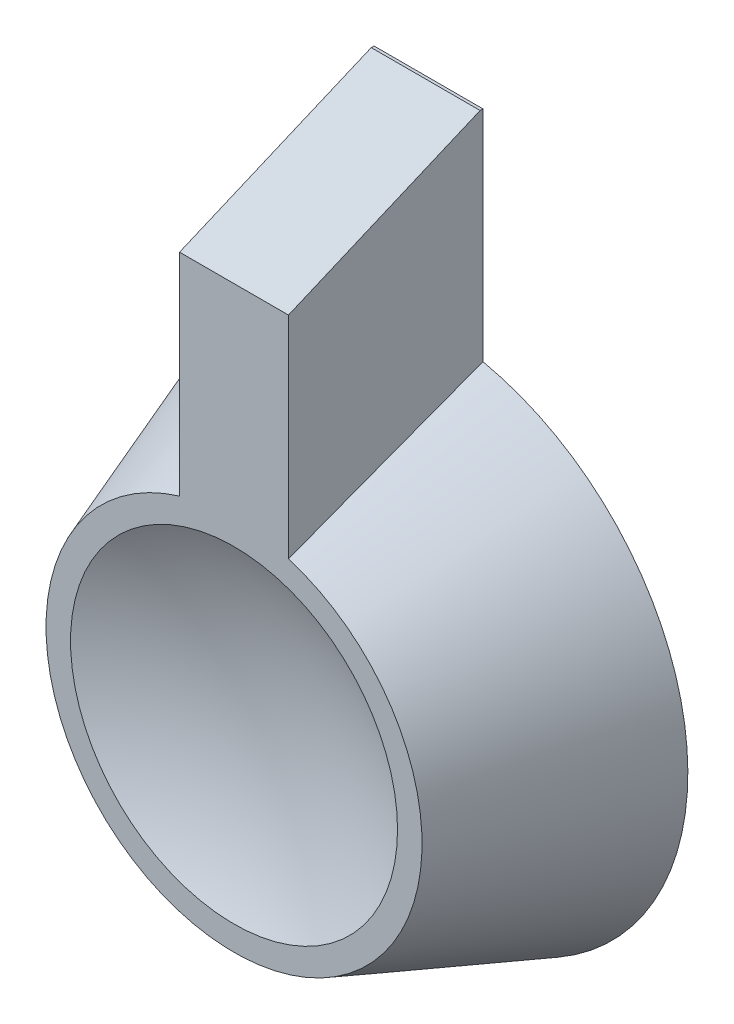
ISO-10303-21;
HEADER;
FILE_DESCRIPTION(('STEP AP214'),'2;1');
FILE_NAME('part.step','',(''),(''),'','','');
FILE_SCHEMA(('AUTOMOTIVE_DESIGN { 1 0 10303 214 1 1 1 1 }'));
ENDSEC;
DATA;
#1=APPLICATION_CONTEXT('core data for automotive mechanical design processes');
#2=APPLICATION_PROTOCOL_DEFINITION('international standard','automotive_design',2000,#1);
#3=PRODUCT_CONTEXT('',#1,'mechanical');
#4=PRODUCT('Part','Part','',(#3));
#5=PRODUCT_RELATED_PRODUCT_CATEGORY('part','',(#4));
#6=PRODUCT_DEFINITION_FORMATION('','',#4);
#7=PRODUCT_DEFINITION_CONTEXT('part definition',#1,'design');
#8=PRODUCT_DEFINITION('design','',#6,#7);
#9=PRODUCT_DEFINITION_SHAPE('','',#8);
#10=(LENGTH_UNIT() NAMED_UNIT(*) SI_UNIT(.MILLI.,.METRE.));
#11=(NAMED_UNIT(*) PLANE_ANGLE_UNIT() SI_UNIT($,.RADIAN.));
#12=(NAMED_UNIT(*) SI_UNIT($,.STERADIAN.) SOLID_ANGLE_UNIT());
#13=UNCERTAINTY_MEASURE_WITH_UNIT(LENGTH_MEASURE(1.E-05),#10,'distance_accuracy_value','');
#14=(GEOMETRIC_REPRESENTATION_CONTEXT(3) GLOBAL_UNCERTAINTY_ASSIGNED_CONTEXT((#13)) GLOBAL_UNIT_ASSIGNED_CONTEXT((#10,
#11,#12)) REPRESENTATION_CONTEXT('',''));
#15=CARTESIAN_POINT('',(0.,0.,0.));
#16=DIRECTION('',(0.,0.,1.));
#17=DIRECTION('',(1.,0.,0.));
#18=AXIS2_PLACEMENT_3D('',#15,#16,#17);
#19=CARTESIAN_POINT('',(0.,0.75,-0.1));
#20=DIRECTION('',(0.,-1.,0.));
#21=DIRECTION('',(1.,0.,0.));
#22=AXIS2_PLACEMENT_3D('',#19,#20,#21);
#23=PLANE('',#22);
#24=CARTESIAN_POINT('',(2.95634909985506,0.749999999998106,0.500000000093635));
#25=CARTESIAN_POINT('',(3.02786630832363,0.749999999999053,0.416793370473385));
#26=CARTESIAN_POINT('',(3.09930954240302,0.749999999999684,0.333523386887634));
#27=CARTESIAN_POINT('',(3.24204805459095,0.750000000000315,0.166856720183341));
#28=CARTESIAN_POINT('',(3.3133433327144,0.750000000000315,0.0834600370775675));
#29=CARTESIAN_POINT('',(3.38456463646358,0.749999999999999,1.90627537618438E-11));
#30=B_SPLINE_CURVE_WITH_KNOTS('',3,(#24,#25,#26,#27,#28,#29),.UNSPECIFIED.,.F.,.F.,(4,2,4),(0.,
0.329153813222395,0.658307593273155),.UNSPECIFIED.);
#31=CARTESIAN_POINT('',(2.95634909983757,0.749999999999994,0.500000000069837));
#32=VERTEX_POINT('',#31);
#33=CARTESIAN_POINT('',(3.38456463644346,0.749999999999999,4.2632564145606E-11));
#34=VERTEX_POINT('',#33);
#35=EDGE_CURVE('E148',#32,#34,#30,.T.);
#36=ORIENTED_EDGE('',*,*,#35,.T.);
#37=DIRECTION('',(1.,0.,0.));
#38=VECTOR('',#37,1.);
#39=CARTESIAN_POINT('',(0.,0.75,2.8421709430404E-11));
#40=LINE('',#39,#38);
#41=CARTESIAN_POINT('',(4.7283883353948,0.749999999999999,4.28222610676579E-11));
#42=VERTEX_POINT('',#41);
#43=EDGE_CURVE('E151',#34,#42,#40,.T.);
#44=ORIENTED_EDGE('',*,*,#43,.T.);
#45=CARTESIAN_POINT('',(4.72838833539125,0.749999999999999,2.88009761255712E-11));
#46=CARTESIAN_POINT('',(4.76424620913798,0.749999999999999,0.141662214308324));
#47=CARTESIAN_POINT('',(4.80009528334224,0.749999999999999,0.28332665478563));
#48=CARTESIAN_POINT('',(4.87177583265981,0.749999999999999,0.566659988112073));
#49=CARTESIAN_POINT('',(4.90760730777312,0.749999999999999,0.708328880961209));
#50=CARTESIAN_POINT('',(4.94342998334396,0.749999999999999,0.850000000008127));
#51=B_SPLINE_CURVE_WITH_KNOTS('',3,(#45,#46,#47,#48,#49,#50),.UNSPECIFIED.,.F.,.F.,(4,2,4),(0.,
0.438389927294705,0.876779854515964),.UNSPECIFIED.);
#52=CARTESIAN_POINT('',(4.94342998333263,0.75000000000001,0.850000000011067));
#53=VERTEX_POINT('',#52);
#54=EDGE_CURVE('E20',#42,#53,#51,.T.);
#55=ORIENTED_EDGE('',*,*,#54,.T.);
#56=DIRECTION('',(0.,0.,1.));
#57=VECTOR('',#56,1.);
#58=CARTESIAN_POINT('',(4.94342998332129,0.750000000000022,-0.1));
#59=LINE('',#58,#57);
#60=CARTESIAN_POINT('',(4.94342998332129,0.75000000000001,4.5));
#61=VERTEX_POINT('',#60);
#62=EDGE_CURVE('E354',#61,#53,#59,.F.);
#63=ORIENTED_EDGE('',*,*,#62,.F.);
#64=DIRECTION('',(1.,0.,0.));
#65=VECTOR('',#64,1.);
#66=CARTESIAN_POINT('',(0.,0.749999999999999,4.5));
#67=LINE('',#66,#65);
#68=CARTESIAN_POINT('',(2.9563490998189,0.749999999999994,4.5));
#69=VERTEX_POINT('',#68);
#70=EDGE_CURVE('E280',#61,#69,#67,.F.);
#71=ORIENTED_EDGE('',*,*,#70,.T.);
#72=DIRECTION('',(0.,0.,1.));
#73=VECTOR('',#72,1.);
#74=CARTESIAN_POINT('',(2.9563490998189,0.749999999999988,-0.1));
#75=LINE('',#74,#73);
#76=EDGE_CURVE('E288',#69,#32,#75,.F.);
#77=ORIENTED_EDGE('',*,*,#76,.T.);
#78=EDGE_LOOP('',(#36,#44,#55,#63,#71,#77));
#79=FACE_BOUND('',#78,.T.);
#80=ADVANCED_FACE('F16',(#79),#23,.T.);
#81=CARTESIAN_POINT('',(-3.5,-6.,-0.1));
#82=DIRECTION('',(1.,0.,0.));
#83=DIRECTION('',(0.,0.,-1.));
#84=AXIS2_PLACEMENT_3D('',#81,#82,#83);
#85=PLANE('',#84);
#86=DIRECTION('',(0.,0.,1.));
#87=VECTOR('',#86,1.);
#88=CARTESIAN_POINT('',(-3.49999999999175,3.57071421427951,-0.1));
#89=LINE('',#88,#87);
#90=CARTESIAN_POINT('',(-3.49999999999588,3.57071421428372,0.850000000010505));
#91=VERTEX_POINT('',#90);
#92=CARTESIAN_POINT('',(-3.49999999999591,3.57071421427543,4.5));
#93=VERTEX_POINT('',#92);
#94=EDGE_CURVE('E287',#91,#93,#89,.T.);
#95=ORIENTED_EDGE('',*,*,#94,.F.);
#96=CARTESIAN_POINT('',(-3.5,3.57071421428793,0.850000000007003));
#97=CARTESIAN_POINT('',(-3.5,3.41531513223394,0.40609143112791));
#98=CARTESIAN_POINT('',(-3.5,3.26652051121143,2.8421709430404E-11));
#99=B_SPLINE_CURVE_WITH_KNOTS('',2,(#96,#97,#98),.UNSPECIFIED.,.F.,.F.,(3,3),(0.,1.),.UNSPECIFIED.);
#100=CARTESIAN_POINT('',(-3.5,3.26652051122415,4.2632564145606E-11));
#101=VERTEX_POINT('',#100);
#102=EDGE_CURVE('E405',#91,#101,#99,.T.);
#103=ORIENTED_EDGE('',*,*,#102,.T.);
#104=DIRECTION('',(0.,1.,0.));
#105=VECTOR('',#104,1.);
#106=CARTESIAN_POINT('',(-3.5,-6.,2.8421709430404E-11));
#107=LINE('',#106,#105);
#108=CARTESIAN_POINT('',(-3.5,4.53052149317802,-1.4210854715202E-11));
#109=VERTEX_POINT('',#108);
#110=EDGE_CURVE('E155',#101,#109,#107,.T.);
#111=ORIENTED_EDGE('',*,*,#110,.T.);
#112=CARTESIAN_POINT('',(-3.5,4.53052149317867,-2.8421709430404E-11));
#113=CARTESIAN_POINT('',(-3.5,4.38369587032704,0.464766211341005));
#114=CARTESIAN_POINT('',(-3.5,4.24264068711901,0.900000000000727));
#115=B_SPLINE_CURVE_WITH_KNOTS('',2,(#112,#113,#114),.UNSPECIFIED.,.F.,.F.,(3,3),(0.,1.),.UNSPECIFIED.);
#116=CARTESIAN_POINT('',(-3.50000000000009,4.24264068711908,0.900000000001091));
#117=VERTEX_POINT('',#116);
#118=EDGE_CURVE('E162',#109,#117,#115,.T.);
#119=ORIENTED_EDGE('',*,*,#118,.T.);
#120=DIRECTION('',(0.,0.,1.));
#121=VECTOR('',#120,1.);
#122=CARTESIAN_POINT('',(-3.50000000000017,4.24264068711914,-0.1));
#123=LINE('',#122,#121);
#124=CARTESIAN_POINT('',(-3.50000000000012,4.24264068711918,4.5));
#125=VERTEX_POINT('',#124);
#126=EDGE_CURVE('E351',#117,#125,#123,.T.);
#127=ORIENTED_EDGE('',*,*,#126,.T.);
#128=DIRECTION('',(0.,1.,0.));
#129=VECTOR('',#128,1.);
#130=CARTESIAN_POINT('',(-3.50000000000007,0.,4.5));
#131=LINE('',#130,#129);
#132=EDGE_CURVE('E278',#125,#93,#131,.F.);
#133=ORIENTED_EDGE('',*,*,#132,.T.);
#134=EDGE_LOOP('',(#95,#103,#111,#119,#127,#133));
#135=FACE_BOUND('',#134,.T.);
#136=ADVANCED_FACE('F245',(#135),#85,.T.);
#137=CARTESIAN_POINT('',(-3.5,-6.,-0.1));
#138=DIRECTION('',(1.,0.,0.));
#139=DIRECTION('',(0.,0.,-1.));
#140=AXIS2_PLACEMENT_3D('',#137,#138,#139);
#141=PLANE('',#140);
#142=DIRECTION('',(0.,0.,1.));
#143=VECTOR('',#142,1.);
#144=CARTESIAN_POINT('',(-3.50000000000007,-4.24264068711923,-0.1));
#145=LINE('',#144,#143);
#146=CARTESIAN_POINT('',(-3.49999999999996,-4.24264068711931,4.5));
#147=VERTEX_POINT('',#146);
#148=CARTESIAN_POINT('',(-3.50000000000004,-4.24264068712305,0.900000000001455));
#149=VERTEX_POINT('',#148);
#150=EDGE_CURVE('E358',#147,#149,#145,.F.);
#151=ORIENTED_EDGE('',*,*,#150,.T.);
#152=CARTESIAN_POINT('',(-3.5,-4.24264068712688,0.900000000001455));
#153=CARTESIAN_POINT('',(-3.5,-4.38369587048344,0.464766210845934));
#154=CARTESIAN_POINT('',(-3.5,-4.53052149317867,-2.8421709430404E-11));
#155=B_SPLINE_CURVE_WITH_KNOTS('',2,(#152,#153,#154),.UNSPECIFIED.,.F.,.F.,(3,3),(0.,1.),.UNSPECIFIED.);
#156=CARTESIAN_POINT('',(-3.5,-4.53052149317802,-1.4210854715202E-11));
#157=VERTEX_POINT('',#156);
#158=EDGE_CURVE('E250',#149,#157,#155,.T.);
#159=ORIENTED_EDGE('',*,*,#158,.T.);
#160=DIRECTION('',(0.,1.,0.));
#161=VECTOR('',#160,1.);
#162=CARTESIAN_POINT('',(-3.5,-6.,-2.8421709430404E-11));
#163=LINE('',#162,#161);
#164=CARTESIAN_POINT('',(-3.5,-3.26652051122486,4.26326183557146E-11));
#165=VERTEX_POINT('',#164);
#166=EDGE_CURVE('E257',#157,#165,#163,.T.);
#167=ORIENTED_EDGE('',*,*,#166,.T.);
#168=CARTESIAN_POINT('',(-3.5,-3.26652051121286,2.84218178506213E-11));
#169=CARTESIAN_POINT('',(-3.5,-3.41531513249915,0.406091431845201));
#170=CARTESIAN_POINT('',(-3.5,-3.57071421021738,0.849999988361538));
#171=B_SPLINE_CURVE_WITH_KNOTS('',2,(#168,#169,#170),.UNSPECIFIED.,.F.,.F.,(3,3),(0.,1.),.UNSPECIFIED.);
#172=CARTESIAN_POINT('',(-3.49999999999993,-3.57071421224447,0.849999994187772));
#173=VERTEX_POINT('',#172);
#174=EDGE_CURVE('E254',#165,#173,#171,.T.);
#175=ORIENTED_EDGE('',*,*,#174,.T.);
#176=DIRECTION('',(0.,0.,1.));
#177=VECTOR('',#176,1.);
#178=CARTESIAN_POINT('',(-3.49999999999986,-3.57071421427157,-0.1));
#179=LINE('',#178,#177);
#180=CARTESIAN_POINT('',(-3.49999999999986,-3.57071421427157,4.5));
#181=VERTEX_POINT('',#180);
#182=EDGE_CURVE('E268',#181,#173,#179,.F.);
#183=ORIENTED_EDGE('',*,*,#182,.F.);
#184=DIRECTION('',(0.,1.,0.));
#185=VECTOR('',#184,1.);
#186=CARTESIAN_POINT('',(-3.49999999999986,0.,4.5));
#187=LINE('',#186,#185);
#188=EDGE_CURVE('E224',#181,#147,#187,.F.);
#189=ORIENTED_EDGE('',*,*,#188,.T.);
#190=EDGE_LOOP('',(#151,#159,#167,#175,#183,#189));
#191=FACE_BOUND('',#190,.T.);
#192=ADVANCED_FACE('F238',(#191),#141,.T.);
#193=CARTESIAN_POINT('',(0.,-0.75,-0.1));
#194=DIRECTION('',(0.,-1.,0.));
#195=DIRECTION('',(1.,0.,0.));
#196=AXIS2_PLACEMENT_3D('',#193,#194,#195);
#197=PLANE('',#196);
#198=DIRECTION('',(1.,0.,0.));
#199=VECTOR('',#198,1.);
#200=CARTESIAN_POINT('',(0.,-0.75,6.13628071965966E-11));
#201=LINE('',#200,#199);
#202=CARTESIAN_POINT('',(3.38456463643778,-0.750000000000001,4.92926058480383E-11));
#203=VERTEX_POINT('',#202);
#204=CARTESIAN_POINT('',(4.72838833539892,-0.750000000000001,5.91031170944605E-11));
#205=VERTEX_POINT('',#204);
#206=EDGE_CURVE('E165',#203,#205,#201,.T.);
#207=ORIENTED_EDGE('',*,*,#206,.F.);
#208=CARTESIAN_POINT('',(2.95634909983741,-0.750000000000001,0.500000000116563));
#209=CARTESIAN_POINT('',(3.0278663083053,-0.750000000000001,0.416793370495934));
#210=CARTESIAN_POINT('',(3.09930954238421,-0.750000000000001,0.333523386909973));
#211=CARTESIAN_POINT('',(3.24204805457157,-0.750000000000001,0.166856720205597));
#212=CARTESIAN_POINT('',(3.31334333269493,-0.750000000000001,0.0834600370999507));
#213=CARTESIAN_POINT('',(3.38456463644422,-0.750000000000001,4.17418791497693E-11));
#214=B_SPLINE_CURVE_WITH_KNOTS('',3,(#208,#209,#210,#211,#212,#213),.UNSPECIFIED.,.F.,.F.,(4,2,
4),(0.,0.329153813221932,0.658307593272231),.UNSPECIFIED.);
#215=CARTESIAN_POINT('',(2.95634909982955,-0.749999999994515,0.500000000109213));
#216=VERTEX_POINT('',#215);
#217=EDGE_CURVE('E227',#216,#203,#214,.T.);
#218=ORIENTED_EDGE('',*,*,#217,.F.);
#219=DIRECTION('',(0.,0.,1.));
#220=VECTOR('',#219,1.);
#221=CARTESIAN_POINT('',(2.95634909982168,-0.749999999989029,-0.1));
#222=LINE('',#221,#220);
#223=CARTESIAN_POINT('',(2.95634909982029,-0.749999999994515,4.5));
#224=VERTEX_POINT('',#223);
#225=EDGE_CURVE('E284',#216,#224,#222,.T.);
#226=ORIENTED_EDGE('',*,*,#225,.T.);
#227=DIRECTION('',(1.,0.,0.));
#228=VECTOR('',#227,1.);
#229=CARTESIAN_POINT('',(0.,-0.75,4.5));
#230=LINE('',#229,#228);
#231=CARTESIAN_POINT('',(4.94342998332142,-0.749999999999167,4.5));
#232=VERTEX_POINT('',#231);
#233=EDGE_CURVE('E282',#224,#232,#230,.T.);
#234=ORIENTED_EDGE('',*,*,#233,.T.);
#235=DIRECTION('',(0.,0.,1.));
#236=VECTOR('',#235,1.);
#237=CARTESIAN_POINT('',(4.94342998332155,-0.749999999998334,-0.1));
#238=LINE('',#237,#236);
#239=CARTESIAN_POINT('',(4.94342998298697,-0.749999999999168,0.849999998643565));
#240=VERTEX_POINT('',#239);
#241=EDGE_CURVE('E271',#240,#232,#238,.T.);
#242=ORIENTED_EDGE('',*,*,#241,.F.);
#243=CARTESIAN_POINT('',(4.72838833539624,-0.750000000000001,4.85195228051522E-11));
#244=CARTESIAN_POINT('',(4.76424620902677,-0.750000000000001,0.141662213868951));
#245=CARTESIAN_POINT('',(4.80009528311488,-0.750000000000001,0.28332665388715));
#246=CARTESIAN_POINT('',(4.87177583220026,-0.750000000000001,0.566659986295353));
#247=CARTESIAN_POINT('',(4.90760730719753,-0.750000000000001,0.708328878685354));
#248=CARTESIAN_POINT('',(4.94342998265238,-0.750000000000001,0.849999997273124));
#249=B_SPLINE_CURVE_WITH_KNOTS('',3,(#243,#244,#245,#246,#247,#248),.UNSPECIFIED.,.F.,.F.,(4,2,
4),(0.,0.438389925873993,0.87677985167454),.UNSPECIFIED.);
#250=EDGE_CURVE('E217',#205,#240,#249,.T.);
#251=ORIENTED_EDGE('',*,*,#250,.F.);
#252=EDGE_LOOP('',(#207,#218,#226,#234,#242,#251));
#253=FACE_BOUND('',#252,.T.);
#254=ADVANCED_FACE('F232',(#253),#197,.F.);
#255=CARTESIAN_POINT('',(0.,0.,4.5));
#256=DIRECTION('',(0.,0.,1.));
#257=DIRECTION('',(1.,0.,0.));
#258=AXIS2_PLACEMENT_3D('',#255,#256,#257);
#259=PLANE('',#258);
#260=ORIENTED_EDGE('',*,*,#233,.F.);
#261=CARTESIAN_POINT('',(0.,0.,4.5));
#262=DIRECTION('',(0.,0.,1.));
#263=DIRECTION('',(1.,0.,0.));
#264=AXIS2_PLACEMENT_3D('',#261,#262,#263);
#265=CIRCLE('',#264,3.05);
#266=EDGE_CURVE('E225',#224,#69,#265,.F.);
#267=ORIENTED_EDGE('',*,*,#266,.T.);
#268=ORIENTED_EDGE('',*,*,#70,.F.);
#269=CARTESIAN_POINT('',(0.,0.,4.5));
#270=DIRECTION('',(0.,0.,1.));
#271=DIRECTION('',(1.,0.,0.));
#272=AXIS2_PLACEMENT_3D('',#269,#270,#271);
#273=CIRCLE('',#272,5.);
#274=EDGE_CURVE('E352',#93,#61,#273,.F.);
#275=ORIENTED_EDGE('',*,*,#274,.F.);
#276=ORIENTED_EDGE('',*,*,#132,.F.);
#277=CARTESIAN_POINT('',(0.,0.,4.5));
#278=DIRECTION('',(0.,0.,1.));
#279=DIRECTION('',(1.,0.,0.));
#280=AXIS2_PLACEMENT_3D('',#277,#278,#279);
#281=CIRCLE('',#280,5.5);
#282=EDGE_CURVE('E272',#125,#147,#281,.F.);
#283=ORIENTED_EDGE('',*,*,#282,.T.);
#284=ORIENTED_EDGE('',*,*,#188,.F.);
#285=CARTESIAN_POINT('',(0.,0.,4.5));
#286=DIRECTION('',(0.,0.,1.));
#287=DIRECTION('',(1.,0.,0.));
#288=AXIS2_PLACEMENT_3D('',#285,#286,#287);
#289=CIRCLE('',#288,5.);
#290=EDGE_CURVE('E275',#232,#181,#289,.F.);
#291=ORIENTED_EDGE('',*,*,#290,.F.);
#292=EDGE_LOOP('',(#260,#267,#268,#275,#276,#283,#284,#291));
#293=FACE_BOUND('',#292,.T.);
#294=ADVANCED_FACE('F237',(#293),#259,.F.);
#295=CARTESIAN_POINT('',(0.,0.,-0.1));
#296=DIRECTION('',(0.,0.,1.));
#297=DIRECTION('',(1.,0.,0.));
#298=AXIS2_PLACEMENT_3D('',#295,#296,#297);
#299=CYLINDRICAL_SURFACE('',#298,3.05);
#300=ORIENTED_EDGE('',*,*,#225,.F.);
#301=CARTESIAN_POINT('',(0.,0.,0.50000000004502));
#302=DIRECTION('',(0.,0.,-1.));
#303=DIRECTION('',(-1.,0.,0.));
#304=AXIS2_PLACEMENT_3D('',#301,#302,#303);
#305=CIRCLE('',#304,3.05000000008704);
#306=EDGE_CURVE('E291',#216,#32,#305,.T.);
#307=ORIENTED_EDGE('',*,*,#306,.T.);
#308=ORIENTED_EDGE('',*,*,#76,.F.);
#309=ORIENTED_EDGE('',*,*,#266,.F.);
#310=EDGE_LOOP('',(#300,#307,#308,#309));
#311=FACE_BOUND('',#310,.T.);
#312=ADVANCED_FACE('F372',(#311),#299,.F.);
#313=CARTESIAN_POINT('',(0.,0.,-0.1));
#314=DIRECTION('',(0.,0.,1.));
#315=DIRECTION('',(1.,0.,0.));
#316=AXIS2_PLACEMENT_3D('',#313,#314,#315);
#317=CYLINDRICAL_SURFACE('',#316,5.);
#318=ORIENTED_EDGE('',*,*,#274,.T.);
#319=ORIENTED_EDGE('',*,*,#62,.T.);
#320=CARTESIAN_POINT('',(0.,0.,0.850000000014006));
#321=DIRECTION('',(0.,0.,1.));
#322=DIRECTION('',(1.,0.,0.));
#323=AXIS2_PLACEMENT_3D('',#320,#321,#322);
#324=CIRCLE('',#323,5.00000000002387);
#325=EDGE_CURVE('E143',#91,#53,#324,.F.);
#326=ORIENTED_EDGE('',*,*,#325,.F.);
#327=ORIENTED_EDGE('',*,*,#94,.T.);
#328=EDGE_LOOP('',(#318,#319,#326,#327));
#329=FACE_BOUND('',#328,.T.);
#330=ADVANCED_FACE('F417',(#329),#317,.T.);
#331=CARTESIAN_POINT('',(0.,0.,-0.1));
#332=DIRECTION('',(0.,0.,1.));
#333=DIRECTION('',(1.,0.,0.));
#334=AXIS2_PLACEMENT_3D('',#331,#332,#333);
#335=CYLINDRICAL_SURFACE('',#334,5.5);
#336=CARTESIAN_POINT('',(0.,0.,0.900000000001455));
#337=DIRECTION('',(0.,0.,-1.));
#338=DIRECTION('',(-1.,0.,0.));
#339=AXIS2_PLACEMENT_3D('',#336,#337,#338);
#340=CIRCLE('',#339,5.50000000001205);
#341=EDGE_CURVE('E267',#117,#149,#340,.T.);
#342=ORIENTED_EDGE('',*,*,#341,.T.);
#343=ORIENTED_EDGE('',*,*,#150,.F.);
#344=ORIENTED_EDGE('',*,*,#282,.F.);
#345=ORIENTED_EDGE('',*,*,#126,.F.);
#346=EDGE_LOOP('',(#342,#343,#344,#345));
#347=FACE_BOUND('',#346,.T.);
#348=ADVANCED_FACE('F399',(#347),#335,.F.);
#349=CARTESIAN_POINT('',(0.,0.,-0.1));
#350=DIRECTION('',(0.,0.,1.));
#351=DIRECTION('',(1.,0.,0.));
#352=AXIS2_PLACEMENT_3D('',#349,#350,#351);
#353=CYLINDRICAL_SURFACE('',#352,5.);
#354=ORIENTED_EDGE('',*,*,#241,.T.);
#355=ORIENTED_EDGE('',*,*,#290,.T.);
#356=ORIENTED_EDGE('',*,*,#182,.T.);
#357=CARTESIAN_POINT('',(0.,0.,0.850000000014006));
#358=DIRECTION('',(0.,0.,1.));
#359=DIRECTION('',(1.,0.,0.));
#360=AXIS2_PLACEMENT_3D('',#357,#358,#359);
#361=CIRCLE('',#360,5.00000000002387);
#362=EDGE_CURVE('E258',#240,#173,#361,.F.);
#363=ORIENTED_EDGE('',*,*,#362,.F.);
#364=EDGE_LOOP('',(#354,#355,#356,#363));
#365=FACE_BOUND('',#364,.T.);
#366=ADVANCED_FACE('F393',(#365),#353,.T.);
#367=CARTESIAN_POINT('',(-2.2,18.22,0.11));
#368=DIRECTION('',(0.,0.,1.));
#369=DIRECTION('',(1.,0.,0.));
#370=AXIS2_PLACEMENT_3D('',#367,#368,#369);
#371=PLANE('',#370);
#372=DIRECTION('',(1.,0.,0.));
#373=VECTOR('',#372,1.);
#374=CARTESIAN_POINT('',(-2.2,18.22,0.11));
#375=LINE('',#374,#373);
#376=CARTESIAN_POINT('',(-2.1,18.22,0.11));
#377=VERTEX_POINT('',#376);
#378=CARTESIAN_POINT('',(2.1,18.22,0.11));
#379=VERTEX_POINT('',#378);
#380=EDGE_CURVE('E266',#377,#379,#375,.T.);
#381=ORIENTED_EDGE('',*,*,#380,.F.);
#382=DIRECTION('',(0.,1.,0.));
#383=VECTOR('',#382,1.);
#384=CARTESIAN_POINT('',(-2.1,6.5,0.11));
#385=LINE('',#384,#383);
#386=CARTESIAN_POINT('',(-2.1,18.2217638550304,0.109999999999963));
#387=VERTEX_POINT('',#386);
#388=EDGE_CURVE('E339',#387,#377,#385,.F.);
#389=ORIENTED_EDGE('',*,*,#388,.F.);
#390=DIRECTION('',(1.,0.,0.));
#391=VECTOR('',#390,1.);
#392=CARTESIAN_POINT('',(-2.5,18.2217638550302,0.109999999999853));
#393=LINE('',#392,#391);
#394=CARTESIAN_POINT('',(2.1,18.2217638550302,0.109999999999927));
#395=VERTEX_POINT('',#394);
#396=EDGE_CURVE('E300',#395,#387,#393,.F.);
#397=ORIENTED_EDGE('',*,*,#396,.F.);
#398=DIRECTION('',(0.,1.,0.));
#399=VECTOR('',#398,1.);
#400=CARTESIAN_POINT('',(2.1,6.5,0.11));
#401=LINE('',#400,#399);
#402=EDGE_CURVE('E294',#379,#395,#401,.T.);
#403=ORIENTED_EDGE('',*,*,#402,.F.);
#404=EDGE_LOOP('',(#381,#389,#397,#403));
#405=FACE_BOUND('',#404,.T.);
#406=ADVANCED_FACE('F344',(#405),#371,.F.);
#407=CARTESIAN_POINT('',(0.,0.,5.6843418860808E-11));
#408=DIRECTION('',(0.,0.,-1.));
#409=DIRECTION('',(-1.,0.,0.));
#410=AXIS2_PLACEMENT_3D('',#407,#408,#409);
#411=CONICAL_SURFACE('',#410,3.4666666667249,0.694738276185521);
#412=ORIENTED_EDGE('',*,*,#306,.F.);
#413=ORIENTED_EDGE('',*,*,#217,.T.);
#414=CARTESIAN_POINT('',(0.,0.,5.6843418860808E-11));
#415=DIRECTION('',(0.,0.,-1.));
#416=DIRECTION('',(-1.,0.,0.));
#417=AXIS2_PLACEMENT_3D('',#414,#415,#416);
#418=CIRCLE('',#417,3.4666666667249);
#419=EDGE_CURVE('E157',#203,#34,#418,.T.);
#420=ORIENTED_EDGE('',*,*,#419,.T.);
#421=ORIENTED_EDGE('',*,*,#35,.F.);
#422=EDGE_LOOP('',(#412,#413,#420,#421));
#423=FACE_BOUND('',#422,.T.);
#424=ADVANCED_FACE('F376',(#423),#411,.F.);
#425=CARTESIAN_POINT('',(0.,0.,0.850000000014006));
#426=DIRECTION('',(0.,0.,1.));
#427=DIRECTION('',(0.,-1.,0.));
#428=AXIS2_PLACEMENT_3D('',#425,#426,#427);
#429=CONICAL_SURFACE('',#428,5.00000000002387,0.244978663126864);
#430=ORIENTED_EDGE('',*,*,#325,.T.);
#431=ORIENTED_EDGE('',*,*,#54,.F.);
#432=CARTESIAN_POINT('',(0.,0.,5.6843418860808E-11));
#433=DIRECTION('',(0.,0.,1.));
#434=DIRECTION('',(0.,-1.,0.));
#435=AXIS2_PLACEMENT_3D('',#432,#433,#434);
#436=CIRCLE('',#435,4.78750000003458);
#437=EDGE_CURVE('E140',#42,#101,#436,.T.);
#438=ORIENTED_EDGE('',*,*,#437,.T.);
#439=ORIENTED_EDGE('',*,*,#102,.F.);
#440=EDGE_LOOP('',(#430,#431,#438,#439));
#441=FACE_BOUND('',#440,.T.);
#442=ADVANCED_FACE('F139',(#441),#429,.T.);
#443=CARTESIAN_POINT('',(0.,0.,0.));
#444=DIRECTION('',(0.,0.,-1.));
#445=DIRECTION('',(-1.,0.,0.));
#446=AXIS2_PLACEMENT_3D('',#443,#444,#445);
#447=CONICAL_SURFACE('',#446,5.72500000001241,0.244978663126864);
#448=ORIENTED_EDGE('',*,*,#118,.F.);
#449=CARTESIAN_POINT('',(0.,0.,0.));
#450=DIRECTION('',(0.,0.,-1.));
#451=DIRECTION('',(-1.,0.,0.));
#452=AXIS2_PLACEMENT_3D('',#449,#450,#451);
#453=CIRCLE('',#452,5.72500000001241);
#454=EDGE_CURVE('E156',#109,#157,#453,.T.);
#455=ORIENTED_EDGE('',*,*,#454,.T.);
#456=ORIENTED_EDGE('',*,*,#158,.F.);
#457=ORIENTED_EDGE('',*,*,#341,.F.);
#458=EDGE_LOOP('',(#448,#455,#456,#457));
#459=FACE_BOUND('',#458,.T.);
#460=ADVANCED_FACE('F214',(#459),#447,.F.);
#461=CARTESIAN_POINT('',(0.,0.,0.850000000014006));
#462=DIRECTION('',(0.,0.,1.));
#463=DIRECTION('',(0.,-1.,0.));
#464=AXIS2_PLACEMENT_3D('',#461,#462,#463);
#465=CONICAL_SURFACE('',#464,5.00000000002387,0.244978663126864);
#466=ORIENTED_EDGE('',*,*,#174,.F.);
#467=CARTESIAN_POINT('',(0.,0.,5.6843418860808E-11));
#468=DIRECTION('',(0.,0.,1.));
#469=DIRECTION('',(0.,-1.,0.));
#470=AXIS2_PLACEMENT_3D('',#467,#468,#469);
#471=CIRCLE('',#470,4.78750000003458);
#472=EDGE_CURVE('E308',#165,#205,#471,.T.);
#473=ORIENTED_EDGE('',*,*,#472,.T.);
#474=ORIENTED_EDGE('',*,*,#250,.T.);
#475=ORIENTED_EDGE('',*,*,#362,.T.);
#476=EDGE_LOOP('',(#466,#473,#474,#475));
#477=FACE_BOUND('',#476,.T.);
#478=ADVANCED_FACE('F209',(#477),#465,.T.);
#479=CARTESIAN_POINT('',(-2.2,18.22,-0.1));
#480=DIRECTION('',(0.,1.,0.));
#481=DIRECTION('',(0.,0.,1.));
#482=AXIS2_PLACEMENT_3D('',#479,#480,#481);
#483=PLANE('',#482);
#484=ORIENTED_EDGE('',*,*,#380,.T.);
#485=DIRECTION('',(0.,0.,1.));
#486=VECTOR('',#485,1.);
#487=CARTESIAN_POINT('',(2.1,18.22,-0.1));
#488=LINE('',#487,#486);
#489=CARTESIAN_POINT('',(2.1,18.22,0.));
#490=VERTEX_POINT('',#489);
#491=EDGE_CURVE('E297',#379,#490,#488,.F.);
#492=ORIENTED_EDGE('',*,*,#491,.T.);
#493=DIRECTION('',(1.,0.,0.));
#494=VECTOR('',#493,1.);
#495=CARTESIAN_POINT('',(0.,18.22,0.));
#496=LINE('',#495,#494);
#497=CARTESIAN_POINT('',(-2.1,18.22,0.));
#498=VERTEX_POINT('',#497);
#499=EDGE_CURVE('E304',#490,#498,#496,.F.);
#500=ORIENTED_EDGE('',*,*,#499,.T.);
#501=DIRECTION('',(0.,0.,-1.));
#502=VECTOR('',#501,1.);
#503=CARTESIAN_POINT('',(-2.1,18.22,0.));
#504=LINE('',#503,#502);
#505=EDGE_CURVE('E314',#498,#377,#504,.F.);
#506=ORIENTED_EDGE('',*,*,#505,.T.);
#507=EDGE_LOOP('',(#484,#492,#500,#506));
#508=FACE_BOUND('',#507,.T.);
#509=ADVANCED_FACE('F206',(#508),#483,.T.);
#510=CARTESIAN_POINT('',(0.,0.,20.));
#511=DIRECTION('',(1.,0.,0.));
#512=DIRECTION('',(0.,-0.457593326496007,-0.889161598105945));
#513=AXIS2_PLACEMENT_3D('',#510,#511,#512);
#514=SPHERICAL_SURFACE('',#513,14.);
#515=CARTESIAN_POINT('',(0.,0.,20.));
#516=DIRECTION('',(0.,0.,1.));
#517=DIRECTION('',(1.,0.,0.));
#518=AXIS2_PLACEMENT_3D('',#515,#516,#517);
#519=SPHERICAL_SURFACE('',#518,14.);
#520=CARTESIAN_POINT('',(0.,0.,7.5));
#521=DIRECTION('',(0.,0.,1.));
#522=DIRECTION('',(1.,0.,0.));
#523=AXIS2_PLACEMENT_3D('',#520,#521,#522);
#524=CIRCLE('',#523,6.30476010645923);
#525=CARTESIAN_POINT('',(6.30476010645924,0.,7.5));
#526=VERTEX_POINT('',#525);
#527=EDGE_CURVE('E195',#526,#526,#524,.F.);
#528=ORIENTED_EDGE('',*,*,#527,.F.);
#529=EDGE_LOOP('',(#528));
#530=FACE_BOUND('',#529,.T.);
#531=ADVANCED_FACE('F18',(#530),#519,.F.);
#532=CARTESIAN_POINT('',(-2.5,15.,7.7));
#533=DIRECTION('',(0.,0.920504853452472,0.3907311284892));
#534=DIRECTION('',(0.,-0.3907311284892,0.920504853452472));
#535=AXIS2_PLACEMENT_3D('',#532,#533,#534);
#536=PLANE('',#535);
#537=DIRECTION('',(0.,-0.390731128489197,0.920504853452473));
#538=VECTOR('',#537,1.);
#539=CARTESIAN_POINT('',(2.1,18.2217638550302,0.109999999999853));
#540=LINE('',#539,#538);
#541=CARTESIAN_POINT('',(2.1,15.0848949632419,7.49999999999999));
#542=VERTEX_POINT('',#541);
#543=EDGE_CURVE('E318',#395,#542,#540,.T.);
#544=ORIENTED_EDGE('',*,*,#543,.F.);
#545=ORIENTED_EDGE('',*,*,#396,.T.);
#546=DIRECTION('',(0.,-0.390731128489239,0.920504853452455));
#547=VECTOR('',#546,1.);
#548=CARTESIAN_POINT('',(-2.1,18.2217638550307,0.109999999999926));
#549=LINE('',#548,#547);
#550=CARTESIAN_POINT('',(-2.1,15.084894963242,7.5));
#551=VERTEX_POINT('',#550);
#552=EDGE_CURVE('E303',#387,#551,#549,.T.);
#553=ORIENTED_EDGE('',*,*,#552,.T.);
#554=DIRECTION('',(1.,0.,0.));
#555=VECTOR('',#554,1.);
#556=CARTESIAN_POINT('',(0.,15.0848949632419,7.5));
#557=LINE('',#556,#555);
#558=EDGE_CURVE('E309',#542,#551,#557,.F.);
#559=ORIENTED_EDGE('',*,*,#558,.F.);
#560=EDGE_LOOP('',(#544,#545,#553,#559));
#561=FACE_BOUND('',#560,.T.);
#562=ADVANCED_FACE('F201',(#561),#536,.T.);
#563=CARTESIAN_POINT('',(-2.1,6.5,0.));
#564=DIRECTION('',(1.,0.,0.));
#565=DIRECTION('',(0.,0.,-1.));
#566=AXIS2_PLACEMENT_3D('',#563,#564,#565);
#567=PLANE('',#566);
#568=ORIENTED_EDGE('',*,*,#505,.F.);
#569=DIRECTION('',(0.,1.,0.));
#570=VECTOR('',#569,1.);
#571=CARTESIAN_POINT('',(-2.1,0.,0.));
#572=LINE('',#571,#570);
#573=CARTESIAN_POINT('',(-2.1,9.77701385904714,0.));
#574=VERTEX_POINT('',#573);
#575=EDGE_CURVE('E307',#498,#574,#572,.F.);
#576=ORIENTED_EDGE('',*,*,#575,.T.);
#577=CARTESIAN_POINT('',(-2.1,6.93920024209911,7.49999999999931));
#578=CARTESIAN_POINT('',(-2.1,7.17823214972594,6.87596626987692));
#579=CARTESIAN_POINT('',(-2.1,7.41641184865141,6.25160708683717));
#580=CARTESIAN_POINT('',(-2.1,7.89140660916872,5.00237183184361));
#581=CARTESIAN_POINT('',(-2.1,8.12822167481885,4.37749576143329));
#582=CARTESIAN_POINT('',(-2.1,8.60082805962136,3.12735784724164));
#583=CARTESIAN_POINT('',(-2.1,8.8366193801061,2.5020960039636));
#584=CARTESIAN_POINT('',(-2.1,9.30738156592646,1.25126137594415));
#585=CARTESIAN_POINT('',(-2.1,9.54235242884052,0.625688590291223));
#586=CARTESIAN_POINT('',(-2.1,9.77701385904714,0.));
#587=B_SPLINE_CURVE_WITH_KNOTS('',3,(#577,#578,#579,#580,#581,#582,#583,#584,#585,#586),
.UNSPECIFIED.,.F.,.F.,(4,2,2,2,4),(0.,2.00473973555687,4.00947350613513,6.01420466686351,
8.01894173950367),.UNSPECIFIED.);
#588=CARTESIAN_POINT('',(-2.1,6.9392002420991,7.49999999999933));
#589=VERTEX_POINT('',#588);
#590=EDGE_CURVE('E187',#589,#574,#587,.T.);
#591=ORIENTED_EDGE('',*,*,#590,.F.);
#592=DIRECTION('',(0.,1.,0.));
#593=VECTOR('',#592,1.);
#594=CARTESIAN_POINT('',(-2.1,0.,7.5));
#595=LINE('',#594,#593);
#596=EDGE_CURVE('E194',#551,#589,#595,.F.);
#597=ORIENTED_EDGE('',*,*,#596,.F.);
#598=ORIENTED_EDGE('',*,*,#552,.F.);
#599=ORIENTED_EDGE('',*,*,#388,.T.);
#600=EDGE_LOOP('',(#568,#576,#591,#597,#598,#599));
#601=FACE_BOUND('',#600,.T.);
#602=ADVANCED_FACE('F197',(#601),#567,.F.);
#603=CARTESIAN_POINT('',(0.,0.,0.));
#604=DIRECTION('',(0.,0.,1.));
#605=DIRECTION('',(1.,0.,0.));
#606=AXIS2_PLACEMENT_3D('',#603,#604,#605);
#607=PLANE('',#606);
#608=ORIENTED_EDGE('',*,*,#575,.F.);
#609=ORIENTED_EDGE('',*,*,#499,.F.);
#610=DIRECTION('',(0.,1.,0.));
#611=VECTOR('',#610,1.);
#612=CARTESIAN_POINT('',(2.1,6.5,0.));
#613=LINE('',#612,#611);
#614=CARTESIAN_POINT('',(2.1,9.77701385904714,0.));
#615=VERTEX_POINT('',#614);
#616=EDGE_CURVE('E320',#615,#490,#613,.T.);
#617=ORIENTED_EDGE('',*,*,#616,.F.);
#618=CARTESIAN_POINT('',(0.,0.,0.));
#619=DIRECTION('',(0.,0.,-1.));
#620=DIRECTION('',(0.,1.,0.));
#621=AXIS2_PLACEMENT_3D('',#618,#619,#620);
#622=CIRCLE('',#621,9.99999999999999);
#623=EDGE_CURVE('E175',#574,#615,#622,.F.);
#624=ORIENTED_EDGE('',*,*,#623,.F.);
#625=EDGE_LOOP('',(#608,#609,#617,#624));
#626=FACE_BOUND('',#625,.T.);
#627=ORIENTED_EDGE('',*,*,#166,.F.);
#628=ORIENTED_EDGE('',*,*,#454,.F.);
#629=ORIENTED_EDGE('',*,*,#110,.F.);
#630=ORIENTED_EDGE('',*,*,#437,.F.);
#631=ORIENTED_EDGE('',*,*,#43,.F.);
#632=ORIENTED_EDGE('',*,*,#419,.F.);
#633=ORIENTED_EDGE('',*,*,#206,.T.);
#634=ORIENTED_EDGE('',*,*,#472,.F.);
#635=EDGE_LOOP('',(#627,#628,#629,#630,#631,#632,#633,#634));
#636=FACE_BOUND('',#635,.T.);
#637=ADVANCED_FACE('F150',(#626,#636),#607,.F.);
#638=CARTESIAN_POINT('',(2.1,6.5,0.));
#639=DIRECTION('',(1.,0.,0.));
#640=DIRECTION('',(0.,0.,-1.));
#641=AXIS2_PLACEMENT_3D('',#638,#639,#640);
#642=PLANE('',#641);
#643=ORIENTED_EDGE('',*,*,#616,.T.);
#644=ORIENTED_EDGE('',*,*,#491,.F.);
#645=ORIENTED_EDGE('',*,*,#402,.T.);
#646=ORIENTED_EDGE('',*,*,#543,.T.);
#647=DIRECTION('',(0.,1.,0.));
#648=VECTOR('',#647,1.);
#649=CARTESIAN_POINT('',(2.1,0.,7.5));
#650=LINE('',#649,#648);
#651=CARTESIAN_POINT('',(2.1,6.93920024209897,7.49999999999968));
#652=VERTEX_POINT('',#651);
#653=EDGE_CURVE('E39',#652,#542,#650,.T.);
#654=ORIENTED_EDGE('',*,*,#653,.F.);
#655=CARTESIAN_POINT('',(2.1,9.77701385904714,0.));
#656=CARTESIAN_POINT('',(2.1,9.54235242884052,0.62568859029122));
#657=CARTESIAN_POINT('',(2.1,9.30738156592646,1.25126137594415));
#658=CARTESIAN_POINT('',(2.1,8.83661938010611,2.5020960039636));
#659=CARTESIAN_POINT('',(2.1,8.60082805962136,3.12735784724164));
#660=CARTESIAN_POINT('',(2.1,8.12822167481885,4.37749576143328));
#661=CARTESIAN_POINT('',(2.1,7.89140660916872,5.0023718318436));
#662=CARTESIAN_POINT('',(2.1,7.41641184865141,6.25160708683717));
#663=CARTESIAN_POINT('',(2.1,7.17823214972595,6.87596626987693));
#664=CARTESIAN_POINT('',(2.1,6.93920024209915,7.49999999999932));
#665=B_SPLINE_CURVE_WITH_KNOTS('',3,(#655,#656,#657,#658,#659,#660,#661,#662,#663,#664),
.UNSPECIFIED.,.F.,.F.,(4,2,2,2,4),(0.,2.00473707264017,4.00946823336854,6.0142020039468,
8.01894173950367),.UNSPECIFIED.);
#666=EDGE_CURVE('E30',#615,#652,#665,.T.);
#667=ORIENTED_EDGE('',*,*,#666,.F.);
#668=EDGE_LOOP('',(#643,#644,#645,#646,#654,#667));
#669=FACE_BOUND('',#668,.T.);
#670=ADVANCED_FACE('F177',(#669),#642,.T.);
#671=CARTESIAN_POINT('',(0.,0.,7.5));
#672=DIRECTION('',(0.,0.,1.));
#673=DIRECTION('',(1.,0.,0.));
#674=AXIS2_PLACEMENT_3D('',#671,#672,#673);
#675=PLANE('',#674);
#676=ORIENTED_EDGE('',*,*,#558,.T.);
#677=ORIENTED_EDGE('',*,*,#596,.T.);
#678=CARTESIAN_POINT('',(0.,0.,7.49999999999936));
#679=DIRECTION('',(0.,0.,-1.));
#680=DIRECTION('',(0.,1.,0.));
#681=AXIS2_PLACEMENT_3D('',#678,#679,#680);
#682=CIRCLE('',#681,7.24999999999642);
#683=EDGE_CURVE('E10',#652,#589,#682,.T.);
#684=ORIENTED_EDGE('',*,*,#683,.F.);
#685=ORIENTED_EDGE('',*,*,#653,.T.);
#686=EDGE_LOOP('',(#676,#677,#684,#685));
#687=FACE_BOUND('',#686,.T.);
#688=ORIENTED_EDGE('',*,*,#527,.T.);
#689=EDGE_LOOP('',(#688));
#690=FACE_BOUND('',#689,.T.);
#691=ADVANCED_FACE('F184',(#687,#690),#675,.T.);
#692=CARTESIAN_POINT('',(0.,0.,0.));
#693=DIRECTION('',(0.,0.,-1.));
#694=DIRECTION('',(0.,1.,0.));
#695=AXIS2_PLACEMENT_3D('',#692,#693,#694);
#696=CONICAL_SURFACE('',#695,9.99999999999999,0.351444794004);
#697=ORIENTED_EDGE('',*,*,#666,.T.);
#698=ORIENTED_EDGE('',*,*,#683,.T.);
#699=ORIENTED_EDGE('',*,*,#590,.T.);
#700=ORIENTED_EDGE('',*,*,#623,.T.);
#701=EDGE_LOOP('',(#697,#698,#699,#700));
#702=FACE_BOUND('',#701,.T.);
#703=ADVANCED_FACE('F181',(#702),#696,.T.);
#704=CLOSED_SHELL('',(#80,#136,#192,#254,#294,#312,#330,#348,#366,#406,#424,#442,#460,#478,#509,
#531,#562,#602,#637,#670,#691,#703));
#705=MANIFOLD_SOLID_BREP('B1',#704);
#706=ADVANCED_BREP_SHAPE_REPRESENTATION('',(#18,#705),#14);
#707=SHAPE_DEFINITION_REPRESENTATION(#9,#706);
ENDSEC;
END-ISO-10303-21;
